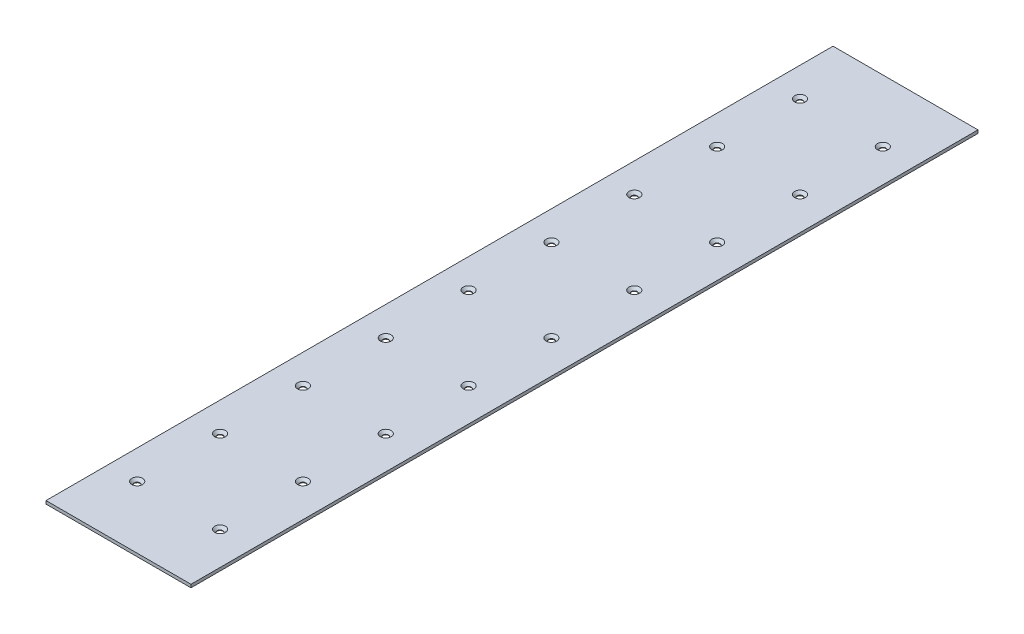
ISO-10303-21;
HEADER;
FILE_DESCRIPTION(('STEP AP214'),'2;1');
FILE_NAME('part.step','',(''),(''),'','','');
FILE_SCHEMA(('AUTOMOTIVE_DESIGN { 1 0 10303 214 1 1 1 1 }'));
ENDSEC;
DATA;
#1=APPLICATION_CONTEXT('core data for automotive mechanical design processes');
#2=APPLICATION_PROTOCOL_DEFINITION('international standard','automotive_design',2000,#1);
#3=PRODUCT_CONTEXT('',#1,'mechanical');
#4=PRODUCT('Part','Part','',(#3));
#5=PRODUCT_RELATED_PRODUCT_CATEGORY('part','',(#4));
#6=PRODUCT_DEFINITION_FORMATION('','',#4);
#7=PRODUCT_DEFINITION_CONTEXT('part definition',#1,'design');
#8=PRODUCT_DEFINITION('design','',#6,#7);
#9=PRODUCT_DEFINITION_SHAPE('','',#8);
#10=(LENGTH_UNIT() NAMED_UNIT(*) SI_UNIT(.MILLI.,.METRE.));
#11=(NAMED_UNIT(*) PLANE_ANGLE_UNIT() SI_UNIT($,.RADIAN.));
#12=(NAMED_UNIT(*) SI_UNIT($,.STERADIAN.) SOLID_ANGLE_UNIT());
#13=UNCERTAINTY_MEASURE_WITH_UNIT(LENGTH_MEASURE(1.E-05),#10,'distance_accuracy_value','');
#14=(GEOMETRIC_REPRESENTATION_CONTEXT(3) GLOBAL_UNCERTAINTY_ASSIGNED_CONTEXT((#13)) GLOBAL_UNIT_ASSIGNED_CONTEXT((#10,
#11,#12)) REPRESENTATION_CONTEXT('',''));
#15=CARTESIAN_POINT('',(0.,0.,0.));
#16=DIRECTION('',(0.,0.,1.));
#17=DIRECTION('',(1.,0.,0.));
#18=AXIS2_PLACEMENT_3D('',#15,#16,#17);
#19=CARTESIAN_POINT('',(0.,-3.,380.));
#20=DIRECTION('',(0.,1.,0.));
#21=DIRECTION('',(0.,0.,1.));
#22=AXIS2_PLACEMENT_3D('',#19,#20,#21);
#23=PLANE('',#22);
#24=CARTESIAN_POINT('',(108.094118077835,-3.,0.));
#25=DIRECTION('',(0.,1.,0.));
#26=DIRECTION('',(0.,0.,1.));
#27=AXIS2_PLACEMENT_3D('',#24,#25,#26);
#28=CIRCLE('',#27,2.75);
#29=CARTESIAN_POINT('',(108.094118077835,-3.,2.75));
#30=VERTEX_POINT('',#29);
#31=EDGE_CURVE('E268',#30,#30,#28,.T.);
#32=ORIENTED_EDGE('',*,*,#31,.T.);
#33=EDGE_LOOP('',(#32));
#34=FACE_BOUND('',#33,.T.);
#35=CARTESIAN_POINT('',(108.094118077835,-3.,-80.));
#36=DIRECTION('',(0.,1.,0.));
#37=DIRECTION('',(0.,0.,1.));
#38=AXIS2_PLACEMENT_3D('',#35,#36,#37);
#39=CIRCLE('',#38,2.75);
#40=CARTESIAN_POINT('',(108.094118077835,-3.,-77.25));
#41=VERTEX_POINT('',#40);
#42=EDGE_CURVE('E259',#41,#41,#39,.T.);
#43=ORIENTED_EDGE('',*,*,#42,.T.);
#44=EDGE_LOOP('',(#43));
#45=FACE_BOUND('',#44,.T.);
#46=CARTESIAN_POINT('',(108.094118077835,-3.,-160.));
#47=DIRECTION('',(0.,1.,0.));
#48=DIRECTION('',(0.,0.,1.));
#49=AXIS2_PLACEMENT_3D('',#46,#47,#48);
#50=CIRCLE('',#49,2.75);
#51=CARTESIAN_POINT('',(108.094118077835,-3.,-157.25));
#52=VERTEX_POINT('',#51);
#53=EDGE_CURVE('E250',#52,#52,#50,.T.);
#54=ORIENTED_EDGE('',*,*,#53,.T.);
#55=EDGE_LOOP('',(#54));
#56=FACE_BOUND('',#55,.T.);
#57=CARTESIAN_POINT('',(108.094118077835,-3.,-240.));
#58=DIRECTION('',(0.,1.,0.));
#59=DIRECTION('',(0.,0.,1.));
#60=AXIS2_PLACEMENT_3D('',#57,#58,#59);
#61=CIRCLE('',#60,2.75);
#62=CARTESIAN_POINT('',(108.094118077835,-3.,-237.25));
#63=VERTEX_POINT('',#62);
#64=EDGE_CURVE('E241',#63,#63,#61,.T.);
#65=ORIENTED_EDGE('',*,*,#64,.T.);
#66=EDGE_LOOP('',(#65));
#67=FACE_BOUND('',#66,.T.);
#68=CARTESIAN_POINT('',(108.094118077835,-3.,-320.));
#69=DIRECTION('',(0.,1.,0.));
#70=DIRECTION('',(0.,0.,1.));
#71=AXIS2_PLACEMENT_3D('',#68,#69,#70);
#72=CIRCLE('',#71,2.75);
#73=CARTESIAN_POINT('',(108.094118077835,-3.,-317.25));
#74=VERTEX_POINT('',#73);
#75=EDGE_CURVE('E232',#74,#74,#72,.T.);
#76=ORIENTED_EDGE('',*,*,#75,.T.);
#77=EDGE_LOOP('',(#76));
#78=FACE_BOUND('',#77,.T.);
#79=CARTESIAN_POINT('',(108.094118077835,-3.,80.));
#80=DIRECTION('',(0.,1.,0.));
#81=DIRECTION('',(0.,0.,1.));
#82=AXIS2_PLACEMENT_3D('',#79,#80,#81);
#83=CIRCLE('',#82,2.75);
#84=CARTESIAN_POINT('',(108.094118077835,-3.,82.75));
#85=VERTEX_POINT('',#84);
#86=EDGE_CURVE('E223',#85,#85,#83,.T.);
#87=ORIENTED_EDGE('',*,*,#86,.T.);
#88=EDGE_LOOP('',(#87));
#89=FACE_BOUND('',#88,.T.);
#90=CARTESIAN_POINT('',(108.094118077835,-3.,160.));
#91=DIRECTION('',(0.,1.,0.));
#92=DIRECTION('',(0.,0.,1.));
#93=AXIS2_PLACEMENT_3D('',#90,#91,#92);
#94=CIRCLE('',#93,2.75);
#95=CARTESIAN_POINT('',(108.094118077835,-3.,162.75));
#96=VERTEX_POINT('',#95);
#97=EDGE_CURVE('E214',#96,#96,#94,.T.);
#98=ORIENTED_EDGE('',*,*,#97,.T.);
#99=EDGE_LOOP('',(#98));
#100=FACE_BOUND('',#99,.T.);
#101=CARTESIAN_POINT('',(108.094118077835,-3.,240.));
#102=DIRECTION('',(0.,1.,0.));
#103=DIRECTION('',(0.,0.,1.));
#104=AXIS2_PLACEMENT_3D('',#101,#102,#103);
#105=CIRCLE('',#104,2.75);
#106=CARTESIAN_POINT('',(108.094118077835,-3.,242.75));
#107=VERTEX_POINT('',#106);
#108=EDGE_CURVE('E205',#107,#107,#105,.T.);
#109=ORIENTED_EDGE('',*,*,#108,.T.);
#110=EDGE_LOOP('',(#109));
#111=FACE_BOUND('',#110,.T.);
#112=CARTESIAN_POINT('',(108.094118077835,-3.,320.));
#113=DIRECTION('',(0.,1.,0.));
#114=DIRECTION('',(0.,0.,1.));
#115=AXIS2_PLACEMENT_3D('',#112,#113,#114);
#116=CIRCLE('',#115,2.75);
#117=CARTESIAN_POINT('',(108.094118077835,-3.,322.75));
#118=VERTEX_POINT('',#117);
#119=EDGE_CURVE('E196',#118,#118,#116,.T.);
#120=ORIENTED_EDGE('',*,*,#119,.T.);
#121=EDGE_LOOP('',(#120));
#122=FACE_BOUND('',#121,.T.);
#123=CARTESIAN_POINT('',(28.0941180778347,-3.,0.));
#124=DIRECTION('',(0.,1.,0.));
#125=DIRECTION('',(0.,0.,1.));
#126=AXIS2_PLACEMENT_3D('',#123,#124,#125);
#127=CIRCLE('',#126,2.75);
#128=CARTESIAN_POINT('',(28.0941180778347,-3.,2.75));
#129=VERTEX_POINT('',#128);
#130=EDGE_CURVE('E187',#129,#129,#127,.T.);
#131=ORIENTED_EDGE('',*,*,#130,.T.);
#132=EDGE_LOOP('',(#131));
#133=FACE_BOUND('',#132,.T.);
#134=CARTESIAN_POINT('',(28.0941180778347,-3.,-80.));
#135=DIRECTION('',(0.,1.,0.));
#136=DIRECTION('',(0.,0.,1.));
#137=AXIS2_PLACEMENT_3D('',#134,#135,#136);
#138=CIRCLE('',#137,2.75);
#139=CARTESIAN_POINT('',(28.0941180778347,-3.,-77.25));
#140=VERTEX_POINT('',#139);
#141=EDGE_CURVE('E178',#140,#140,#138,.T.);
#142=ORIENTED_EDGE('',*,*,#141,.T.);
#143=EDGE_LOOP('',(#142));
#144=FACE_BOUND('',#143,.T.);
#145=CARTESIAN_POINT('',(28.0941180778347,-3.,-160.));
#146=DIRECTION('',(0.,1.,0.));
#147=DIRECTION('',(0.,0.,1.));
#148=AXIS2_PLACEMENT_3D('',#145,#146,#147);
#149=CIRCLE('',#148,2.75);
#150=CARTESIAN_POINT('',(28.0941180778347,-3.,-157.25));
#151=VERTEX_POINT('',#150);
#152=EDGE_CURVE('E169',#151,#151,#149,.T.);
#153=ORIENTED_EDGE('',*,*,#152,.T.);
#154=EDGE_LOOP('',(#153));
#155=FACE_BOUND('',#154,.T.);
#156=CARTESIAN_POINT('',(28.0941180778347,-3.,-240.));
#157=DIRECTION('',(0.,1.,0.));
#158=DIRECTION('',(0.,0.,1.));
#159=AXIS2_PLACEMENT_3D('',#156,#157,#158);
#160=CIRCLE('',#159,2.75);
#161=CARTESIAN_POINT('',(28.0941180778347,-3.,-237.25));
#162=VERTEX_POINT('',#161);
#163=EDGE_CURVE('E160',#162,#162,#160,.T.);
#164=ORIENTED_EDGE('',*,*,#163,.T.);
#165=EDGE_LOOP('',(#164));
#166=FACE_BOUND('',#165,.T.);
#167=CARTESIAN_POINT('',(28.0941180778347,-3.,-320.));
#168=DIRECTION('',(0.,1.,0.));
#169=DIRECTION('',(0.,0.,1.));
#170=AXIS2_PLACEMENT_3D('',#167,#168,#169);
#171=CIRCLE('',#170,2.75);
#172=CARTESIAN_POINT('',(28.0941180778347,-3.,-317.25));
#173=VERTEX_POINT('',#172);
#174=EDGE_CURVE('E151',#173,#173,#171,.T.);
#175=ORIENTED_EDGE('',*,*,#174,.T.);
#176=EDGE_LOOP('',(#175));
#177=FACE_BOUND('',#176,.T.);
#178=CARTESIAN_POINT('',(28.0941180778347,-3.,80.));
#179=DIRECTION('',(0.,1.,0.));
#180=DIRECTION('',(0.,0.,1.));
#181=AXIS2_PLACEMENT_3D('',#178,#179,#180);
#182=CIRCLE('',#181,2.75);
#183=CARTESIAN_POINT('',(28.0941180778347,-3.,82.75));
#184=VERTEX_POINT('',#183);
#185=EDGE_CURVE('E142',#184,#184,#182,.T.);
#186=ORIENTED_EDGE('',*,*,#185,.T.);
#187=EDGE_LOOP('',(#186));
#188=FACE_BOUND('',#187,.T.);
#189=CARTESIAN_POINT('',(28.0941180778347,-3.,160.));
#190=DIRECTION('',(0.,1.,0.));
#191=DIRECTION('',(0.,0.,1.));
#192=AXIS2_PLACEMENT_3D('',#189,#190,#191);
#193=CIRCLE('',#192,2.75);
#194=CARTESIAN_POINT('',(28.0941180778347,-3.,162.75));
#195=VERTEX_POINT('',#194);
#196=EDGE_CURVE('E133',#195,#195,#193,.T.);
#197=ORIENTED_EDGE('',*,*,#196,.T.);
#198=EDGE_LOOP('',(#197));
#199=FACE_BOUND('',#198,.T.);
#200=CARTESIAN_POINT('',(28.0941180778347,-3.,240.));
#201=DIRECTION('',(0.,1.,0.));
#202=DIRECTION('',(0.,0.,1.));
#203=AXIS2_PLACEMENT_3D('',#200,#201,#202);
#204=CIRCLE('',#203,2.75);
#205=CARTESIAN_POINT('',(28.0941180778347,-3.,242.75));
#206=VERTEX_POINT('',#205);
#207=EDGE_CURVE('E124',#206,#206,#204,.T.);
#208=ORIENTED_EDGE('',*,*,#207,.T.);
#209=EDGE_LOOP('',(#208));
#210=FACE_BOUND('',#209,.T.);
#211=CARTESIAN_POINT('',(28.0941180778347,-3.,320.));
#212=DIRECTION('',(0.,1.,0.));
#213=DIRECTION('',(0.,0.,1.));
#214=AXIS2_PLACEMENT_3D('',#211,#212,#213);
#215=CIRCLE('',#214,2.75);
#216=CARTESIAN_POINT('',(28.0941180778347,-3.,322.75));
#217=VERTEX_POINT('',#216);
#218=EDGE_CURVE('E106',#217,#217,#215,.T.);
#219=ORIENTED_EDGE('',*,*,#218,.T.);
#220=EDGE_LOOP('',(#219));
#221=FACE_BOUND('',#220,.T.);
#222=DIRECTION('',(1.,0.,0.));
#223=VECTOR('',#222,1.);
#224=CARTESIAN_POINT('',(0.,-3.,-380.));
#225=LINE('',#224,#223);
#226=CARTESIAN_POINT('',(0.,-3.,-380.));
#227=VERTEX_POINT('',#226);
#228=CARTESIAN_POINT('',(140.,-3.,-380.));
#229=VERTEX_POINT('',#228);
#230=EDGE_CURVE('E104',#227,#229,#225,.T.);
#231=ORIENTED_EDGE('',*,*,#230,.T.);
#232=DIRECTION('',(0.,0.,-1.));
#233=VECTOR('',#232,1.);
#234=CARTESIAN_POINT('',(140.,-3.,380.));
#235=LINE('',#234,#233);
#236=CARTESIAN_POINT('',(140.,-3.,380.));
#237=VERTEX_POINT('',#236);
#238=EDGE_CURVE('E12',#237,#229,#235,.T.);
#239=ORIENTED_EDGE('',*,*,#238,.F.);
#240=DIRECTION('',(1.,0.,0.));
#241=VECTOR('',#240,1.);
#242=CARTESIAN_POINT('',(0.,-3.,380.));
#243=LINE('',#242,#241);
#244=CARTESIAN_POINT('',(0.,-3.,380.));
#245=VERTEX_POINT('',#244);
#246=EDGE_CURVE('E81',#245,#237,#243,.T.);
#247=ORIENTED_EDGE('',*,*,#246,.F.);
#248=DIRECTION('',(0.,0.,-1.));
#249=VECTOR('',#248,1.);
#250=CARTESIAN_POINT('',(0.,-3.,380.));
#251=LINE('',#250,#249);
#252=EDGE_CURVE('E57',#245,#227,#251,.T.);
#253=ORIENTED_EDGE('',*,*,#252,.T.);
#254=EDGE_LOOP('',(#231,#239,#247,#253));
#255=FACE_BOUND('',#254,.T.);
#256=ADVANCED_FACE('F41',(#34,#45,#56,#67,#78,#89,#100,#111,#122,#133,#144,#155,#166,#177,#188,
#199,#210,#221,#255),#23,.F.);
#257=CARTESIAN_POINT('',(140.,0.,380.));
#258=DIRECTION('',(1.,0.,0.));
#259=DIRECTION('',(0.,0.,-1.));
#260=AXIS2_PLACEMENT_3D('',#257,#258,#259);
#261=PLANE('',#260);
#262=DIRECTION('',(0.,-1.,0.));
#263=VECTOR('',#262,1.);
#264=CARTESIAN_POINT('',(140.,0.,-380.));
#265=LINE('',#264,#263);
#266=CARTESIAN_POINT('',(140.,0.,-380.));
#267=VERTEX_POINT('',#266);
#268=EDGE_CURVE('E90',#267,#229,#265,.T.);
#269=ORIENTED_EDGE('',*,*,#268,.F.);
#270=DIRECTION('',(0.,0.,-1.));
#271=VECTOR('',#270,1.);
#272=CARTESIAN_POINT('',(140.,0.,380.));
#273=LINE('',#272,#271);
#274=CARTESIAN_POINT('',(140.,0.,380.));
#275=VERTEX_POINT('',#274);
#276=EDGE_CURVE('E49',#275,#267,#273,.T.);
#277=ORIENTED_EDGE('',*,*,#276,.F.);
#278=DIRECTION('',(0.,-1.,0.));
#279=VECTOR('',#278,1.);
#280=CARTESIAN_POINT('',(140.,0.,380.));
#281=LINE('',#280,#279);
#282=EDGE_CURVE('E88',#275,#237,#281,.T.);
#283=ORIENTED_EDGE('',*,*,#282,.T.);
#284=ORIENTED_EDGE('',*,*,#238,.T.);
#285=EDGE_LOOP('',(#269,#277,#283,#284));
#286=FACE_BOUND('',#285,.T.);
#287=ADVANCED_FACE('F87',(#286),#261,.T.);
#288=CARTESIAN_POINT('',(0.,0.,380.));
#289=DIRECTION('',(0.,1.,0.));
#290=DIRECTION('',(0.,0.,1.));
#291=AXIS2_PLACEMENT_3D('',#288,#289,#290);
#292=PLANE('',#291);
#293=CARTESIAN_POINT('',(108.094118077835,0.,0.));
#294=DIRECTION('',(0.,1.,0.));
#295=DIRECTION('',(0.,0.,1.));
#296=AXIS2_PLACEMENT_3D('',#293,#294,#295);
#297=CIRCLE('',#296,5.2);
#298=CARTESIAN_POINT('',(108.094118077835,0.,5.2));
#299=VERTEX_POINT('',#298);
#300=EDGE_CURVE('E274',#299,#299,#297,.T.);
#301=ORIENTED_EDGE('',*,*,#300,.F.);
#302=EDGE_LOOP('',(#301));
#303=FACE_BOUND('',#302,.T.);
#304=CARTESIAN_POINT('',(108.094118077835,0.,-80.));
#305=DIRECTION('',(0.,1.,0.));
#306=DIRECTION('',(0.,0.,1.));
#307=AXIS2_PLACEMENT_3D('',#304,#305,#306);
#308=CIRCLE('',#307,5.2);
#309=CARTESIAN_POINT('',(108.094118077835,0.,-74.8));
#310=VERTEX_POINT('',#309);
#311=EDGE_CURVE('E265',#310,#310,#308,.T.);
#312=ORIENTED_EDGE('',*,*,#311,.F.);
#313=EDGE_LOOP('',(#312));
#314=FACE_BOUND('',#313,.T.);
#315=CARTESIAN_POINT('',(108.094118077835,0.,-160.));
#316=DIRECTION('',(0.,1.,0.));
#317=DIRECTION('',(0.,0.,1.));
#318=AXIS2_PLACEMENT_3D('',#315,#316,#317);
#319=CIRCLE('',#318,5.2);
#320=CARTESIAN_POINT('',(108.094118077835,0.,-154.8));
#321=VERTEX_POINT('',#320);
#322=EDGE_CURVE('E256',#321,#321,#319,.T.);
#323=ORIENTED_EDGE('',*,*,#322,.F.);
#324=EDGE_LOOP('',(#323));
#325=FACE_BOUND('',#324,.T.);
#326=CARTESIAN_POINT('',(108.094118077835,0.,-240.));
#327=DIRECTION('',(0.,1.,0.));
#328=DIRECTION('',(0.,0.,1.));
#329=AXIS2_PLACEMENT_3D('',#326,#327,#328);
#330=CIRCLE('',#329,5.2);
#331=CARTESIAN_POINT('',(108.094118077835,0.,-234.8));
#332=VERTEX_POINT('',#331);
#333=EDGE_CURVE('E247',#332,#332,#330,.T.);
#334=ORIENTED_EDGE('',*,*,#333,.F.);
#335=EDGE_LOOP('',(#334));
#336=FACE_BOUND('',#335,.T.);
#337=CARTESIAN_POINT('',(108.094118077835,0.,-320.));
#338=DIRECTION('',(0.,1.,0.));
#339=DIRECTION('',(0.,0.,1.));
#340=AXIS2_PLACEMENT_3D('',#337,#338,#339);
#341=CIRCLE('',#340,5.2);
#342=CARTESIAN_POINT('',(108.094118077835,0.,-314.8));
#343=VERTEX_POINT('',#342);
#344=EDGE_CURVE('E238',#343,#343,#341,.T.);
#345=ORIENTED_EDGE('',*,*,#344,.F.);
#346=EDGE_LOOP('',(#345));
#347=FACE_BOUND('',#346,.T.);
#348=CARTESIAN_POINT('',(108.094118077835,0.,80.));
#349=DIRECTION('',(0.,1.,0.));
#350=DIRECTION('',(0.,0.,1.));
#351=AXIS2_PLACEMENT_3D('',#348,#349,#350);
#352=CIRCLE('',#351,5.2);
#353=CARTESIAN_POINT('',(108.094118077835,0.,85.2));
#354=VERTEX_POINT('',#353);
#355=EDGE_CURVE('E229',#354,#354,#352,.T.);
#356=ORIENTED_EDGE('',*,*,#355,.F.);
#357=EDGE_LOOP('',(#356));
#358=FACE_BOUND('',#357,.T.);
#359=CARTESIAN_POINT('',(108.094118077835,0.,160.));
#360=DIRECTION('',(0.,1.,0.));
#361=DIRECTION('',(0.,0.,1.));
#362=AXIS2_PLACEMENT_3D('',#359,#360,#361);
#363=CIRCLE('',#362,5.2);
#364=CARTESIAN_POINT('',(108.094118077835,0.,165.2));
#365=VERTEX_POINT('',#364);
#366=EDGE_CURVE('E220',#365,#365,#363,.T.);
#367=ORIENTED_EDGE('',*,*,#366,.F.);
#368=EDGE_LOOP('',(#367));
#369=FACE_BOUND('',#368,.T.);
#370=CARTESIAN_POINT('',(108.094118077835,0.,240.));
#371=DIRECTION('',(0.,1.,0.));
#372=DIRECTION('',(0.,0.,1.));
#373=AXIS2_PLACEMENT_3D('',#370,#371,#372);
#374=CIRCLE('',#373,5.2);
#375=CARTESIAN_POINT('',(108.094118077835,0.,245.2));
#376=VERTEX_POINT('',#375);
#377=EDGE_CURVE('E211',#376,#376,#374,.T.);
#378=ORIENTED_EDGE('',*,*,#377,.F.);
#379=EDGE_LOOP('',(#378));
#380=FACE_BOUND('',#379,.T.);
#381=CARTESIAN_POINT('',(108.094118077835,0.,320.));
#382=DIRECTION('',(0.,1.,0.));
#383=DIRECTION('',(0.,0.,1.));
#384=AXIS2_PLACEMENT_3D('',#381,#382,#383);
#385=CIRCLE('',#384,5.2);
#386=CARTESIAN_POINT('',(108.094118077835,0.,325.2));
#387=VERTEX_POINT('',#386);
#388=EDGE_CURVE('E202',#387,#387,#385,.T.);
#389=ORIENTED_EDGE('',*,*,#388,.F.);
#390=EDGE_LOOP('',(#389));
#391=FACE_BOUND('',#390,.T.);
#392=CARTESIAN_POINT('',(28.0941180778347,0.,0.));
#393=DIRECTION('',(0.,1.,0.));
#394=DIRECTION('',(0.,0.,1.));
#395=AXIS2_PLACEMENT_3D('',#392,#393,#394);
#396=CIRCLE('',#395,5.2);
#397=CARTESIAN_POINT('',(28.0941180778347,0.,5.2));
#398=VERTEX_POINT('',#397);
#399=EDGE_CURVE('E193',#398,#398,#396,.T.);
#400=ORIENTED_EDGE('',*,*,#399,.F.);
#401=EDGE_LOOP('',(#400));
#402=FACE_BOUND('',#401,.T.);
#403=CARTESIAN_POINT('',(28.0941180778347,0.,-80.));
#404=DIRECTION('',(0.,1.,0.));
#405=DIRECTION('',(0.,0.,1.));
#406=AXIS2_PLACEMENT_3D('',#403,#404,#405);
#407=CIRCLE('',#406,5.2);
#408=CARTESIAN_POINT('',(28.0941180778347,0.,-74.8));
#409=VERTEX_POINT('',#408);
#410=EDGE_CURVE('E184',#409,#409,#407,.T.);
#411=ORIENTED_EDGE('',*,*,#410,.F.);
#412=EDGE_LOOP('',(#411));
#413=FACE_BOUND('',#412,.T.);
#414=CARTESIAN_POINT('',(28.0941180778347,0.,-160.));
#415=DIRECTION('',(0.,1.,0.));
#416=DIRECTION('',(0.,0.,1.));
#417=AXIS2_PLACEMENT_3D('',#414,#415,#416);
#418=CIRCLE('',#417,5.2);
#419=CARTESIAN_POINT('',(28.0941180778347,0.,-154.8));
#420=VERTEX_POINT('',#419);
#421=EDGE_CURVE('E175',#420,#420,#418,.T.);
#422=ORIENTED_EDGE('',*,*,#421,.F.);
#423=EDGE_LOOP('',(#422));
#424=FACE_BOUND('',#423,.T.);
#425=CARTESIAN_POINT('',(28.0941180778347,0.,-240.));
#426=DIRECTION('',(0.,1.,0.));
#427=DIRECTION('',(0.,0.,1.));
#428=AXIS2_PLACEMENT_3D('',#425,#426,#427);
#429=CIRCLE('',#428,5.2);
#430=CARTESIAN_POINT('',(28.0941180778347,0.,-234.8));
#431=VERTEX_POINT('',#430);
#432=EDGE_CURVE('E166',#431,#431,#429,.T.);
#433=ORIENTED_EDGE('',*,*,#432,.F.);
#434=EDGE_LOOP('',(#433));
#435=FACE_BOUND('',#434,.T.);
#436=CARTESIAN_POINT('',(28.0941180778347,0.,-320.));
#437=DIRECTION('',(0.,1.,0.));
#438=DIRECTION('',(0.,0.,1.));
#439=AXIS2_PLACEMENT_3D('',#436,#437,#438);
#440=CIRCLE('',#439,5.2);
#441=CARTESIAN_POINT('',(28.0941180778347,0.,-314.8));
#442=VERTEX_POINT('',#441);
#443=EDGE_CURVE('E157',#442,#442,#440,.T.);
#444=ORIENTED_EDGE('',*,*,#443,.F.);
#445=EDGE_LOOP('',(#444));
#446=FACE_BOUND('',#445,.T.);
#447=CARTESIAN_POINT('',(28.0941180778347,0.,80.));
#448=DIRECTION('',(0.,1.,0.));
#449=DIRECTION('',(0.,0.,1.));
#450=AXIS2_PLACEMENT_3D('',#447,#448,#449);
#451=CIRCLE('',#450,5.2);
#452=CARTESIAN_POINT('',(28.0941180778347,0.,85.2));
#453=VERTEX_POINT('',#452);
#454=EDGE_CURVE('E148',#453,#453,#451,.T.);
#455=ORIENTED_EDGE('',*,*,#454,.F.);
#456=EDGE_LOOP('',(#455));
#457=FACE_BOUND('',#456,.T.);
#458=CARTESIAN_POINT('',(28.0941180778347,0.,160.));
#459=DIRECTION('',(0.,1.,0.));
#460=DIRECTION('',(0.,0.,1.));
#461=AXIS2_PLACEMENT_3D('',#458,#459,#460);
#462=CIRCLE('',#461,5.2);
#463=CARTESIAN_POINT('',(28.0941180778347,0.,165.2));
#464=VERTEX_POINT('',#463);
#465=EDGE_CURVE('E139',#464,#464,#462,.T.);
#466=ORIENTED_EDGE('',*,*,#465,.F.);
#467=EDGE_LOOP('',(#466));
#468=FACE_BOUND('',#467,.T.);
#469=CARTESIAN_POINT('',(28.0941180778347,0.,240.));
#470=DIRECTION('',(0.,1.,0.));
#471=DIRECTION('',(0.,0.,1.));
#472=AXIS2_PLACEMENT_3D('',#469,#470,#471);
#473=CIRCLE('',#472,5.2);
#474=CARTESIAN_POINT('',(28.0941180778347,0.,245.2));
#475=VERTEX_POINT('',#474);
#476=EDGE_CURVE('E130',#475,#475,#473,.T.);
#477=ORIENTED_EDGE('',*,*,#476,.F.);
#478=EDGE_LOOP('',(#477));
#479=FACE_BOUND('',#478,.T.);
#480=CARTESIAN_POINT('',(28.0941180778347,0.,320.));
#481=DIRECTION('',(0.,1.,0.));
#482=DIRECTION('',(0.,0.,1.));
#483=AXIS2_PLACEMENT_3D('',#480,#481,#482);
#484=CIRCLE('',#483,5.2);
#485=CARTESIAN_POINT('',(28.0941180778347,0.,325.2));
#486=VERTEX_POINT('',#485);
#487=EDGE_CURVE('E121',#486,#486,#484,.T.);
#488=ORIENTED_EDGE('',*,*,#487,.F.);
#489=EDGE_LOOP('',(#488));
#490=FACE_BOUND('',#489,.T.);
#491=DIRECTION('',(1.,0.,0.));
#492=VECTOR('',#491,1.);
#493=CARTESIAN_POINT('',(0.,0.,-380.));
#494=LINE('',#493,#492);
#495=CARTESIAN_POINT('',(0.,0.,-380.));
#496=VERTEX_POINT('',#495);
#497=EDGE_CURVE('E108',#496,#267,#494,.T.);
#498=ORIENTED_EDGE('',*,*,#497,.F.);
#499=DIRECTION('',(0.,0.,-1.));
#500=VECTOR('',#499,1.);
#501=CARTESIAN_POINT('',(0.,0.,380.));
#502=LINE('',#501,#500);
#503=CARTESIAN_POINT('',(0.,0.,380.));
#504=VERTEX_POINT('',#503);
#505=EDGE_CURVE('E70',#504,#496,#502,.T.);
#506=ORIENTED_EDGE('',*,*,#505,.F.);
#507=DIRECTION('',(1.,0.,0.));
#508=VECTOR('',#507,1.);
#509=CARTESIAN_POINT('',(0.,0.,380.));
#510=LINE('',#509,#508);
#511=EDGE_CURVE('E96',#504,#275,#510,.T.);
#512=ORIENTED_EDGE('',*,*,#511,.T.);
#513=ORIENTED_EDGE('',*,*,#276,.T.);
#514=EDGE_LOOP('',(#498,#506,#512,#513));
#515=FACE_BOUND('',#514,.T.);
#516=ADVANCED_FACE('F98',(#303,#314,#325,#336,#347,#358,#369,#380,#391,#402,#413,#424,#435,#446,
#457,#468,#479,#490,#515),#292,.T.);
#517=CARTESIAN_POINT('',(0.,-3.,380.));
#518=DIRECTION('',(-1.,0.,0.));
#519=DIRECTION('',(0.,0.,1.));
#520=AXIS2_PLACEMENT_3D('',#517,#518,#519);
#521=PLANE('',#520);
#522=DIRECTION('',(0.,1.,0.));
#523=VECTOR('',#522,1.);
#524=CARTESIAN_POINT('',(0.,-3.,-380.));
#525=LINE('',#524,#523);
#526=EDGE_CURVE('E110',#227,#496,#525,.T.);
#527=ORIENTED_EDGE('',*,*,#526,.F.);
#528=ORIENTED_EDGE('',*,*,#252,.F.);
#529=DIRECTION('',(0.,1.,0.));
#530=VECTOR('',#529,1.);
#531=CARTESIAN_POINT('',(0.,-3.,380.));
#532=LINE('',#531,#530);
#533=EDGE_CURVE('E99',#245,#504,#532,.T.);
#534=ORIENTED_EDGE('',*,*,#533,.T.);
#535=ORIENTED_EDGE('',*,*,#505,.T.);
#536=EDGE_LOOP('',(#527,#528,#534,#535));
#537=FACE_BOUND('',#536,.T.);
#538=ADVANCED_FACE('F282',(#537),#521,.T.);
#539=CARTESIAN_POINT('',(0.,0.,380.));
#540=DIRECTION('',(0.,0.,-1.));
#541=DIRECTION('',(-1.,0.,0.));
#542=AXIS2_PLACEMENT_3D('',#539,#540,#541);
#543=PLANE('',#542);
#544=ORIENTED_EDGE('',*,*,#246,.T.);
#545=ORIENTED_EDGE('',*,*,#282,.F.);
#546=ORIENTED_EDGE('',*,*,#511,.F.);
#547=ORIENTED_EDGE('',*,*,#533,.F.);
#548=EDGE_LOOP('',(#544,#545,#546,#547));
#549=FACE_BOUND('',#548,.T.);
#550=ADVANCED_FACE('F95',(#549),#543,.F.);
#551=CARTESIAN_POINT('',(0.,0.,-380.));
#552=DIRECTION('',(0.,0.,-1.));
#553=DIRECTION('',(-1.,0.,0.));
#554=AXIS2_PLACEMENT_3D('',#551,#552,#553);
#555=PLANE('',#554);
#556=ORIENTED_EDGE('',*,*,#230,.F.);
#557=ORIENTED_EDGE('',*,*,#526,.T.);
#558=ORIENTED_EDGE('',*,*,#497,.T.);
#559=ORIENTED_EDGE('',*,*,#268,.T.);
#560=EDGE_LOOP('',(#556,#557,#558,#559));
#561=FACE_BOUND('',#560,.T.);
#562=ADVANCED_FACE('F331',(#561),#555,.T.);
#563=CARTESIAN_POINT('',(28.0941180778347,0.,320.));
#564=DIRECTION('',(0.,1.,0.));
#565=DIRECTION('',(0.,0.,1.));
#566=AXIS2_PLACEMENT_3D('',#563,#564,#565);
#567=CYLINDRICAL_SURFACE('',#566,2.75);
#568=ORIENTED_EDGE('',*,*,#218,.F.);
#569=EDGE_LOOP('',(#568));
#570=FACE_BOUND('',#569,.T.);
#571=CARTESIAN_POINT('',(28.0941180778347,-2.45,320.));
#572=DIRECTION('',(0.,1.,0.));
#573=DIRECTION('',(0.,0.,1.));
#574=AXIS2_PLACEMENT_3D('',#571,#572,#573);
#575=CIRCLE('',#574,2.75);
#576=CARTESIAN_POINT('',(28.0941180778347,-2.45,322.75));
#577=VERTEX_POINT('',#576);
#578=EDGE_CURVE('E118',#577,#577,#575,.T.);
#579=ORIENTED_EDGE('',*,*,#578,.T.);
#580=EDGE_LOOP('',(#579));
#581=FACE_BOUND('',#580,.T.);
#582=ADVANCED_FACE('F321',(#570,#581),#567,.F.);
#583=CARTESIAN_POINT('',(28.0941180778347,0.,320.));
#584=DIRECTION('',(0.,1.,0.));
#585=DIRECTION('',(0.,0.,1.));
#586=AXIS2_PLACEMENT_3D('',#583,#584,#585);
#587=CONICAL_SURFACE('',#586,5.2,0.785398163397447);
#588=ORIENTED_EDGE('',*,*,#578,.F.);
#589=EDGE_LOOP('',(#588));
#590=FACE_BOUND('',#589,.T.);
#591=ORIENTED_EDGE('',*,*,#487,.T.);
#592=EDGE_LOOP('',(#591));
#593=FACE_BOUND('',#592,.T.);
#594=ADVANCED_FACE('F318',(#590,#593),#587,.F.);
#595=CARTESIAN_POINT('',(28.0941180778347,0.,240.));
#596=DIRECTION('',(0.,1.,0.));
#597=DIRECTION('',(0.,0.,1.));
#598=AXIS2_PLACEMENT_3D('',#595,#596,#597);
#599=CYLINDRICAL_SURFACE('',#598,2.75);
#600=ORIENTED_EDGE('',*,*,#207,.F.);
#601=EDGE_LOOP('',(#600));
#602=FACE_BOUND('',#601,.T.);
#603=CARTESIAN_POINT('',(28.0941180778347,-2.45,240.));
#604=DIRECTION('',(0.,1.,0.));
#605=DIRECTION('',(0.,0.,1.));
#606=AXIS2_PLACEMENT_3D('',#603,#604,#605);
#607=CIRCLE('',#606,2.75);
#608=CARTESIAN_POINT('',(28.0941180778347,-2.45,242.75));
#609=VERTEX_POINT('',#608);
#610=EDGE_CURVE('E127',#609,#609,#607,.T.);
#611=ORIENTED_EDGE('',*,*,#610,.T.);
#612=EDGE_LOOP('',(#611));
#613=FACE_BOUND('',#612,.T.);
#614=ADVANCED_FACE('F320',(#602,#613),#599,.F.);
#615=CARTESIAN_POINT('',(28.0941180778347,0.,240.));
#616=DIRECTION('',(0.,1.,0.));
#617=DIRECTION('',(0.,0.,1.));
#618=AXIS2_PLACEMENT_3D('',#615,#616,#617);
#619=CONICAL_SURFACE('',#618,5.2,0.785398163397447);
#620=ORIENTED_EDGE('',*,*,#610,.F.);
#621=EDGE_LOOP('',(#620));
#622=FACE_BOUND('',#621,.T.);
#623=ORIENTED_EDGE('',*,*,#476,.T.);
#624=EDGE_LOOP('',(#623));
#625=FACE_BOUND('',#624,.T.);
#626=ADVANCED_FACE('F328',(#622,#625),#619,.F.);
#627=CARTESIAN_POINT('',(28.0941180778347,0.,160.));
#628=DIRECTION('',(0.,1.,0.));
#629=DIRECTION('',(0.,0.,1.));
#630=AXIS2_PLACEMENT_3D('',#627,#628,#629);
#631=CYLINDRICAL_SURFACE('',#630,2.75);
#632=ORIENTED_EDGE('',*,*,#196,.F.);
#633=EDGE_LOOP('',(#632));
#634=FACE_BOUND('',#633,.T.);
#635=CARTESIAN_POINT('',(28.0941180778347,-2.45,160.));
#636=DIRECTION('',(0.,1.,0.));
#637=DIRECTION('',(0.,0.,1.));
#638=AXIS2_PLACEMENT_3D('',#635,#636,#637);
#639=CIRCLE('',#638,2.75);
#640=CARTESIAN_POINT('',(28.0941180778347,-2.45,162.75));
#641=VERTEX_POINT('',#640);
#642=EDGE_CURVE('E136',#641,#641,#639,.T.);
#643=ORIENTED_EDGE('',*,*,#642,.T.);
#644=EDGE_LOOP('',(#643));
#645=FACE_BOUND('',#644,.T.);
#646=ADVANCED_FACE('F425',(#634,#645),#631,.F.);
#647=CARTESIAN_POINT('',(28.0941180778347,0.,160.));
#648=DIRECTION('',(0.,1.,0.));
#649=DIRECTION('',(0.,0.,1.));
#650=AXIS2_PLACEMENT_3D('',#647,#648,#649);
#651=CONICAL_SURFACE('',#650,5.2,0.785398163397447);
#652=ORIENTED_EDGE('',*,*,#642,.F.);
#653=EDGE_LOOP('',(#652));
#654=FACE_BOUND('',#653,.T.);
#655=ORIENTED_EDGE('',*,*,#465,.T.);
#656=EDGE_LOOP('',(#655));
#657=FACE_BOUND('',#656,.T.);
#658=ADVANCED_FACE('F435',(#654,#657),#651,.F.);
#659=CARTESIAN_POINT('',(28.0941180778347,0.,80.));
#660=DIRECTION('',(0.,1.,0.));
#661=DIRECTION('',(0.,0.,1.));
#662=AXIS2_PLACEMENT_3D('',#659,#660,#661);
#663=CYLINDRICAL_SURFACE('',#662,2.75);
#664=ORIENTED_EDGE('',*,*,#185,.F.);
#665=EDGE_LOOP('',(#664));
#666=FACE_BOUND('',#665,.T.);
#667=CARTESIAN_POINT('',(28.0941180778347,-2.45,80.));
#668=DIRECTION('',(0.,1.,0.));
#669=DIRECTION('',(0.,0.,1.));
#670=AXIS2_PLACEMENT_3D('',#667,#668,#669);
#671=CIRCLE('',#670,2.75);
#672=CARTESIAN_POINT('',(28.0941180778347,-2.45,82.75));
#673=VERTEX_POINT('',#672);
#674=EDGE_CURVE('E145',#673,#673,#671,.T.);
#675=ORIENTED_EDGE('',*,*,#674,.T.);
#676=EDGE_LOOP('',(#675));
#677=FACE_BOUND('',#676,.T.);
#678=ADVANCED_FACE('F445',(#666,#677),#663,.F.);
#679=CARTESIAN_POINT('',(28.0941180778347,0.,80.));
#680=DIRECTION('',(0.,1.,0.));
#681=DIRECTION('',(0.,0.,1.));
#682=AXIS2_PLACEMENT_3D('',#679,#680,#681);
#683=CONICAL_SURFACE('',#682,5.2,0.785398163397447);
#684=ORIENTED_EDGE('',*,*,#674,.F.);
#685=EDGE_LOOP('',(#684));
#686=FACE_BOUND('',#685,.T.);
#687=ORIENTED_EDGE('',*,*,#454,.T.);
#688=EDGE_LOOP('',(#687));
#689=FACE_BOUND('',#688,.T.);
#690=ADVANCED_FACE('F455',(#686,#689),#683,.F.);
#691=CARTESIAN_POINT('',(28.0941180778347,0.,-320.));
#692=DIRECTION('',(0.,1.,0.));
#693=DIRECTION('',(0.,0.,1.));
#694=AXIS2_PLACEMENT_3D('',#691,#692,#693);
#695=CYLINDRICAL_SURFACE('',#694,2.75);
#696=ORIENTED_EDGE('',*,*,#174,.F.);
#697=EDGE_LOOP('',(#696));
#698=FACE_BOUND('',#697,.T.);
#699=CARTESIAN_POINT('',(28.0941180778347,-2.45,-320.));
#700=DIRECTION('',(0.,1.,0.));
#701=DIRECTION('',(0.,0.,1.));
#702=AXIS2_PLACEMENT_3D('',#699,#700,#701);
#703=CIRCLE('',#702,2.75);
#704=CARTESIAN_POINT('',(28.0941180778347,-2.45,-317.25));
#705=VERTEX_POINT('',#704);
#706=EDGE_CURVE('E154',#705,#705,#703,.T.);
#707=ORIENTED_EDGE('',*,*,#706,.T.);
#708=EDGE_LOOP('',(#707));
#709=FACE_BOUND('',#708,.T.);
#710=ADVANCED_FACE('F465',(#698,#709),#695,.F.);
#711=CARTESIAN_POINT('',(28.0941180778347,0.,-320.));
#712=DIRECTION('',(0.,1.,0.));
#713=DIRECTION('',(0.,0.,1.));
#714=AXIS2_PLACEMENT_3D('',#711,#712,#713);
#715=CONICAL_SURFACE('',#714,5.2,0.785398163397447);
#716=ORIENTED_EDGE('',*,*,#706,.F.);
#717=EDGE_LOOP('',(#716));
#718=FACE_BOUND('',#717,.T.);
#719=ORIENTED_EDGE('',*,*,#443,.T.);
#720=EDGE_LOOP('',(#719));
#721=FACE_BOUND('',#720,.T.);
#722=ADVANCED_FACE('F475',(#718,#721),#715,.F.);
#723=CARTESIAN_POINT('',(28.0941180778347,0.,-240.));
#724=DIRECTION('',(0.,1.,0.));
#725=DIRECTION('',(0.,0.,1.));
#726=AXIS2_PLACEMENT_3D('',#723,#724,#725);
#727=CYLINDRICAL_SURFACE('',#726,2.75);
#728=ORIENTED_EDGE('',*,*,#163,.F.);
#729=EDGE_LOOP('',(#728));
#730=FACE_BOUND('',#729,.T.);
#731=CARTESIAN_POINT('',(28.0941180778347,-2.45,-240.));
#732=DIRECTION('',(0.,1.,0.));
#733=DIRECTION('',(0.,0.,1.));
#734=AXIS2_PLACEMENT_3D('',#731,#732,#733);
#735=CIRCLE('',#734,2.75);
#736=CARTESIAN_POINT('',(28.0941180778347,-2.45,-237.25));
#737=VERTEX_POINT('',#736);
#738=EDGE_CURVE('E163',#737,#737,#735,.T.);
#739=ORIENTED_EDGE('',*,*,#738,.T.);
#740=EDGE_LOOP('',(#739));
#741=FACE_BOUND('',#740,.T.);
#742=ADVANCED_FACE('F485',(#730,#741),#727,.F.);
#743=CARTESIAN_POINT('',(28.0941180778347,0.,-240.));
#744=DIRECTION('',(0.,1.,0.));
#745=DIRECTION('',(0.,0.,1.));
#746=AXIS2_PLACEMENT_3D('',#743,#744,#745);
#747=CONICAL_SURFACE('',#746,5.2,0.785398163397447);
#748=ORIENTED_EDGE('',*,*,#738,.F.);
#749=EDGE_LOOP('',(#748));
#750=FACE_BOUND('',#749,.T.);
#751=ORIENTED_EDGE('',*,*,#432,.T.);
#752=EDGE_LOOP('',(#751));
#753=FACE_BOUND('',#752,.T.);
#754=ADVANCED_FACE('F495',(#750,#753),#747,.F.);
#755=CARTESIAN_POINT('',(28.0941180778347,0.,-160.));
#756=DIRECTION('',(0.,1.,0.));
#757=DIRECTION('',(0.,0.,1.));
#758=AXIS2_PLACEMENT_3D('',#755,#756,#757);
#759=CYLINDRICAL_SURFACE('',#758,2.75);
#760=ORIENTED_EDGE('',*,*,#152,.F.);
#761=EDGE_LOOP('',(#760));
#762=FACE_BOUND('',#761,.T.);
#763=CARTESIAN_POINT('',(28.0941180778347,-2.45,-160.));
#764=DIRECTION('',(0.,1.,0.));
#765=DIRECTION('',(0.,0.,1.));
#766=AXIS2_PLACEMENT_3D('',#763,#764,#765);
#767=CIRCLE('',#766,2.75);
#768=CARTESIAN_POINT('',(28.0941180778347,-2.45,-157.25));
#769=VERTEX_POINT('',#768);
#770=EDGE_CURVE('E172',#769,#769,#767,.T.);
#771=ORIENTED_EDGE('',*,*,#770,.T.);
#772=EDGE_LOOP('',(#771));
#773=FACE_BOUND('',#772,.T.);
#774=ADVANCED_FACE('F505',(#762,#773),#759,.F.);
#775=CARTESIAN_POINT('',(28.0941180778347,0.,-160.));
#776=DIRECTION('',(0.,1.,0.));
#777=DIRECTION('',(0.,0.,1.));
#778=AXIS2_PLACEMENT_3D('',#775,#776,#777);
#779=CONICAL_SURFACE('',#778,5.2,0.785398163397447);
#780=ORIENTED_EDGE('',*,*,#770,.F.);
#781=EDGE_LOOP('',(#780));
#782=FACE_BOUND('',#781,.T.);
#783=ORIENTED_EDGE('',*,*,#421,.T.);
#784=EDGE_LOOP('',(#783));
#785=FACE_BOUND('',#784,.T.);
#786=ADVANCED_FACE('F515',(#782,#785),#779,.F.);
#787=CARTESIAN_POINT('',(28.0941180778347,0.,-80.));
#788=DIRECTION('',(0.,1.,0.));
#789=DIRECTION('',(0.,0.,1.));
#790=AXIS2_PLACEMENT_3D('',#787,#788,#789);
#791=CYLINDRICAL_SURFACE('',#790,2.75);
#792=ORIENTED_EDGE('',*,*,#141,.F.);
#793=EDGE_LOOP('',(#792));
#794=FACE_BOUND('',#793,.T.);
#795=CARTESIAN_POINT('',(28.0941180778347,-2.45,-80.));
#796=DIRECTION('',(0.,1.,0.));
#797=DIRECTION('',(0.,0.,1.));
#798=AXIS2_PLACEMENT_3D('',#795,#796,#797);
#799=CIRCLE('',#798,2.75);
#800=CARTESIAN_POINT('',(28.0941180778347,-2.45,-77.25));
#801=VERTEX_POINT('',#800);
#802=EDGE_CURVE('E181',#801,#801,#799,.T.);
#803=ORIENTED_EDGE('',*,*,#802,.T.);
#804=EDGE_LOOP('',(#803));
#805=FACE_BOUND('',#804,.T.);
#806=ADVANCED_FACE('F525',(#794,#805),#791,.F.);
#807=CARTESIAN_POINT('',(28.0941180778347,0.,-80.));
#808=DIRECTION('',(0.,1.,0.));
#809=DIRECTION('',(0.,0.,1.));
#810=AXIS2_PLACEMENT_3D('',#807,#808,#809);
#811=CONICAL_SURFACE('',#810,5.2,0.785398163397447);
#812=ORIENTED_EDGE('',*,*,#802,.F.);
#813=EDGE_LOOP('',(#812));
#814=FACE_BOUND('',#813,.T.);
#815=ORIENTED_EDGE('',*,*,#410,.T.);
#816=EDGE_LOOP('',(#815));
#817=FACE_BOUND('',#816,.T.);
#818=ADVANCED_FACE('F535',(#814,#817),#811,.F.);
#819=CARTESIAN_POINT('',(28.0941180778347,0.,0.));
#820=DIRECTION('',(0.,1.,0.));
#821=DIRECTION('',(0.,0.,1.));
#822=AXIS2_PLACEMENT_3D('',#819,#820,#821);
#823=CYLINDRICAL_SURFACE('',#822,2.75);
#824=ORIENTED_EDGE('',*,*,#130,.F.);
#825=EDGE_LOOP('',(#824));
#826=FACE_BOUND('',#825,.T.);
#827=CARTESIAN_POINT('',(28.0941180778347,-2.45,0.));
#828=DIRECTION('',(0.,1.,0.));
#829=DIRECTION('',(0.,0.,1.));
#830=AXIS2_PLACEMENT_3D('',#827,#828,#829);
#831=CIRCLE('',#830,2.75);
#832=CARTESIAN_POINT('',(28.0941180778347,-2.45,2.75));
#833=VERTEX_POINT('',#832);
#834=EDGE_CURVE('E190',#833,#833,#831,.T.);
#835=ORIENTED_EDGE('',*,*,#834,.T.);
#836=EDGE_LOOP('',(#835));
#837=FACE_BOUND('',#836,.T.);
#838=ADVANCED_FACE('F545',(#826,#837),#823,.F.);
#839=CARTESIAN_POINT('',(28.0941180778347,0.,0.));
#840=DIRECTION('',(0.,1.,0.));
#841=DIRECTION('',(0.,0.,1.));
#842=AXIS2_PLACEMENT_3D('',#839,#840,#841);
#843=CONICAL_SURFACE('',#842,5.2,0.785398163397447);
#844=ORIENTED_EDGE('',*,*,#834,.F.);
#845=EDGE_LOOP('',(#844));
#846=FACE_BOUND('',#845,.T.);
#847=ORIENTED_EDGE('',*,*,#399,.T.);
#848=EDGE_LOOP('',(#847));
#849=FACE_BOUND('',#848,.T.);
#850=ADVANCED_FACE('F554',(#846,#849),#843,.F.);
#851=CARTESIAN_POINT('',(108.094118077835,0.,320.));
#852=DIRECTION('',(0.,1.,0.));
#853=DIRECTION('',(0.,0.,1.));
#854=AXIS2_PLACEMENT_3D('',#851,#852,#853);
#855=CYLINDRICAL_SURFACE('',#854,2.75);
#856=ORIENTED_EDGE('',*,*,#119,.F.);
#857=EDGE_LOOP('',(#856));
#858=FACE_BOUND('',#857,.T.);
#859=CARTESIAN_POINT('',(108.094118077835,-2.45,320.));
#860=DIRECTION('',(0.,1.,0.));
#861=DIRECTION('',(0.,0.,1.));
#862=AXIS2_PLACEMENT_3D('',#859,#860,#861);
#863=CIRCLE('',#862,2.75);
#864=CARTESIAN_POINT('',(108.094118077835,-2.45,322.75));
#865=VERTEX_POINT('',#864);
#866=EDGE_CURVE('E199',#865,#865,#863,.T.);
#867=ORIENTED_EDGE('',*,*,#866,.T.);
#868=EDGE_LOOP('',(#867));
#869=FACE_BOUND('',#868,.T.);
#870=ADVANCED_FACE('F563',(#858,#869),#855,.F.);
#871=CARTESIAN_POINT('',(108.094118077835,0.,320.));
#872=DIRECTION('',(0.,1.,0.));
#873=DIRECTION('',(0.,0.,1.));
#874=AXIS2_PLACEMENT_3D('',#871,#872,#873);
#875=CONICAL_SURFACE('',#874,5.2,0.785398163397446);
#876=ORIENTED_EDGE('',*,*,#866,.F.);
#877=EDGE_LOOP('',(#876));
#878=FACE_BOUND('',#877,.T.);
#879=ORIENTED_EDGE('',*,*,#388,.T.);
#880=EDGE_LOOP('',(#879));
#881=FACE_BOUND('',#880,.T.);
#882=ADVANCED_FACE('F574',(#878,#881),#875,.F.);
#883=CARTESIAN_POINT('',(108.094118077835,0.,240.));
#884=DIRECTION('',(0.,1.,0.));
#885=DIRECTION('',(0.,0.,1.));
#886=AXIS2_PLACEMENT_3D('',#883,#884,#885);
#887=CYLINDRICAL_SURFACE('',#886,2.75);
#888=ORIENTED_EDGE('',*,*,#108,.F.);
#889=EDGE_LOOP('',(#888));
#890=FACE_BOUND('',#889,.T.);
#891=CARTESIAN_POINT('',(108.094118077835,-2.45,240.));
#892=DIRECTION('',(0.,1.,0.));
#893=DIRECTION('',(0.,0.,1.));
#894=AXIS2_PLACEMENT_3D('',#891,#892,#893);
#895=CIRCLE('',#894,2.75);
#896=CARTESIAN_POINT('',(108.094118077835,-2.45,242.75));
#897=VERTEX_POINT('',#896);
#898=EDGE_CURVE('E208',#897,#897,#895,.T.);
#899=ORIENTED_EDGE('',*,*,#898,.T.);
#900=EDGE_LOOP('',(#899));
#901=FACE_BOUND('',#900,.T.);
#902=ADVANCED_FACE('F581',(#890,#901),#887,.F.);
#903=CARTESIAN_POINT('',(108.094118077835,0.,240.));
#904=DIRECTION('',(0.,1.,0.));
#905=DIRECTION('',(0.,0.,1.));
#906=AXIS2_PLACEMENT_3D('',#903,#904,#905);
#907=CONICAL_SURFACE('',#906,5.2,0.785398163397446);
#908=ORIENTED_EDGE('',*,*,#898,.F.);
#909=EDGE_LOOP('',(#908));
#910=FACE_BOUND('',#909,.T.);
#911=ORIENTED_EDGE('',*,*,#377,.T.);
#912=EDGE_LOOP('',(#911));
#913=FACE_BOUND('',#912,.T.);
#914=ADVANCED_FACE('F589',(#910,#913),#907,.F.);
#915=CARTESIAN_POINT('',(108.094118077835,0.,160.));
#916=DIRECTION('',(0.,1.,0.));
#917=DIRECTION('',(0.,0.,1.));
#918=AXIS2_PLACEMENT_3D('',#915,#916,#917);
#919=CYLINDRICAL_SURFACE('',#918,2.75);
#920=ORIENTED_EDGE('',*,*,#97,.F.);
#921=EDGE_LOOP('',(#920));
#922=FACE_BOUND('',#921,.T.);
#923=CARTESIAN_POINT('',(108.094118077835,-2.45,160.));
#924=DIRECTION('',(0.,1.,0.));
#925=DIRECTION('',(0.,0.,1.));
#926=AXIS2_PLACEMENT_3D('',#923,#924,#925);
#927=CIRCLE('',#926,2.75);
#928=CARTESIAN_POINT('',(108.094118077835,-2.45,162.75));
#929=VERTEX_POINT('',#928);
#930=EDGE_CURVE('E217',#929,#929,#927,.T.);
#931=ORIENTED_EDGE('',*,*,#930,.T.);
#932=EDGE_LOOP('',(#931));
#933=FACE_BOUND('',#932,.T.);
#934=ADVANCED_FACE('F597',(#922,#933),#919,.F.);
#935=CARTESIAN_POINT('',(108.094118077835,0.,160.));
#936=DIRECTION('',(0.,1.,0.));
#937=DIRECTION('',(0.,0.,1.));
#938=AXIS2_PLACEMENT_3D('',#935,#936,#937);
#939=CONICAL_SURFACE('',#938,5.2,0.785398163397446);
#940=ORIENTED_EDGE('',*,*,#930,.F.);
#941=EDGE_LOOP('',(#940));
#942=FACE_BOUND('',#941,.T.);
#943=ORIENTED_EDGE('',*,*,#366,.T.);
#944=EDGE_LOOP('',(#943));
#945=FACE_BOUND('',#944,.T.);
#946=ADVANCED_FACE('F605',(#942,#945),#939,.F.);
#947=CARTESIAN_POINT('',(108.094118077835,0.,80.));
#948=DIRECTION('',(0.,1.,0.));
#949=DIRECTION('',(0.,0.,1.));
#950=AXIS2_PLACEMENT_3D('',#947,#948,#949);
#951=CYLINDRICAL_SURFACE('',#950,2.75);
#952=ORIENTED_EDGE('',*,*,#86,.F.);
#953=EDGE_LOOP('',(#952));
#954=FACE_BOUND('',#953,.T.);
#955=CARTESIAN_POINT('',(108.094118077835,-2.45,80.));
#956=DIRECTION('',(0.,1.,0.));
#957=DIRECTION('',(0.,0.,1.));
#958=AXIS2_PLACEMENT_3D('',#955,#956,#957);
#959=CIRCLE('',#958,2.75);
#960=CARTESIAN_POINT('',(108.094118077835,-2.45,82.75));
#961=VERTEX_POINT('',#960);
#962=EDGE_CURVE('E226',#961,#961,#959,.T.);
#963=ORIENTED_EDGE('',*,*,#962,.T.);
#964=EDGE_LOOP('',(#963));
#965=FACE_BOUND('',#964,.T.);
#966=ADVANCED_FACE('F613',(#954,#965),#951,.F.);
#967=CARTESIAN_POINT('',(108.094118077835,0.,80.));
#968=DIRECTION('',(0.,1.,0.));
#969=DIRECTION('',(0.,0.,1.));
#970=AXIS2_PLACEMENT_3D('',#967,#968,#969);
#971=CONICAL_SURFACE('',#970,5.2,0.785398163397446);
#972=ORIENTED_EDGE('',*,*,#962,.F.);
#973=EDGE_LOOP('',(#972));
#974=FACE_BOUND('',#973,.T.);
#975=ORIENTED_EDGE('',*,*,#355,.T.);
#976=EDGE_LOOP('',(#975));
#977=FACE_BOUND('',#976,.T.);
#978=ADVANCED_FACE('F621',(#974,#977),#971,.F.);
#979=CARTESIAN_POINT('',(108.094118077835,0.,-320.));
#980=DIRECTION('',(0.,1.,0.));
#981=DIRECTION('',(0.,0.,1.));
#982=AXIS2_PLACEMENT_3D('',#979,#980,#981);
#983=CYLINDRICAL_SURFACE('',#982,2.75);
#984=ORIENTED_EDGE('',*,*,#75,.F.);
#985=EDGE_LOOP('',(#984));
#986=FACE_BOUND('',#985,.T.);
#987=CARTESIAN_POINT('',(108.094118077835,-2.45,-320.));
#988=DIRECTION('',(0.,1.,0.));
#989=DIRECTION('',(0.,0.,1.));
#990=AXIS2_PLACEMENT_3D('',#987,#988,#989);
#991=CIRCLE('',#990,2.75);
#992=CARTESIAN_POINT('',(108.094118077835,-2.45,-317.25));
#993=VERTEX_POINT('',#992);
#994=EDGE_CURVE('E235',#993,#993,#991,.T.);
#995=ORIENTED_EDGE('',*,*,#994,.T.);
#996=EDGE_LOOP('',(#995));
#997=FACE_BOUND('',#996,.T.);
#998=ADVANCED_FACE('F629',(#986,#997),#983,.F.);
#999=CARTESIAN_POINT('',(108.094118077835,0.,-320.));
#1000=DIRECTION('',(0.,1.,0.));
#1001=DIRECTION('',(0.,0.,1.));
#1002=AXIS2_PLACEMENT_3D('',#999,#1000,#1001);
#1003=CONICAL_SURFACE('',#1002,5.2,0.785398163397446);
#1004=ORIENTED_EDGE('',*,*,#994,.F.);
#1005=EDGE_LOOP('',(#1004));
#1006=FACE_BOUND('',#1005,.T.);
#1007=ORIENTED_EDGE('',*,*,#344,.T.);
#1008=EDGE_LOOP('',(#1007));
#1009=FACE_BOUND('',#1008,.T.);
#1010=ADVANCED_FACE('F637',(#1006,#1009),#1003,.F.);
#1011=CARTESIAN_POINT('',(108.094118077835,0.,-240.));
#1012=DIRECTION('',(0.,1.,0.));
#1013=DIRECTION('',(0.,0.,1.));
#1014=AXIS2_PLACEMENT_3D('',#1011,#1012,#1013);
#1015=CYLINDRICAL_SURFACE('',#1014,2.75);
#1016=ORIENTED_EDGE('',*,*,#64,.F.);
#1017=EDGE_LOOP('',(#1016));
#1018=FACE_BOUND('',#1017,.T.);
#1019=CARTESIAN_POINT('',(108.094118077835,-2.45,-240.));
#1020=DIRECTION('',(0.,1.,0.));
#1021=DIRECTION('',(0.,0.,1.));
#1022=AXIS2_PLACEMENT_3D('',#1019,#1020,#1021);
#1023=CIRCLE('',#1022,2.75);
#1024=CARTESIAN_POINT('',(108.094118077835,-2.45,-237.25));
#1025=VERTEX_POINT('',#1024);
#1026=EDGE_CURVE('E244',#1025,#1025,#1023,.T.);
#1027=ORIENTED_EDGE('',*,*,#1026,.T.);
#1028=EDGE_LOOP('',(#1027));
#1029=FACE_BOUND('',#1028,.T.);
#1030=ADVANCED_FACE('F645',(#1018,#1029),#1015,.F.);
#1031=CARTESIAN_POINT('',(108.094118077835,0.,-240.));
#1032=DIRECTION('',(0.,1.,0.));
#1033=DIRECTION('',(0.,0.,1.));
#1034=AXIS2_PLACEMENT_3D('',#1031,#1032,#1033);
#1035=CONICAL_SURFACE('',#1034,5.2,0.785398163397446);
#1036=ORIENTED_EDGE('',*,*,#1026,.F.);
#1037=EDGE_LOOP('',(#1036));
#1038=FACE_BOUND('',#1037,.T.);
#1039=ORIENTED_EDGE('',*,*,#333,.T.);
#1040=EDGE_LOOP('',(#1039));
#1041=FACE_BOUND('',#1040,.T.);
#1042=ADVANCED_FACE('F653',(#1038,#1041),#1035,.F.);
#1043=CARTESIAN_POINT('',(108.094118077835,0.,-160.));
#1044=DIRECTION('',(0.,1.,0.));
#1045=DIRECTION('',(0.,0.,1.));
#1046=AXIS2_PLACEMENT_3D('',#1043,#1044,#1045);
#1047=CYLINDRICAL_SURFACE('',#1046,2.75);
#1048=ORIENTED_EDGE('',*,*,#53,.F.);
#1049=EDGE_LOOP('',(#1048));
#1050=FACE_BOUND('',#1049,.T.);
#1051=CARTESIAN_POINT('',(108.094118077835,-2.45,-160.));
#1052=DIRECTION('',(0.,1.,0.));
#1053=DIRECTION('',(0.,0.,1.));
#1054=AXIS2_PLACEMENT_3D('',#1051,#1052,#1053);
#1055=CIRCLE('',#1054,2.75);
#1056=CARTESIAN_POINT('',(108.094118077835,-2.45,-157.25));
#1057=VERTEX_POINT('',#1056);
#1058=EDGE_CURVE('E253',#1057,#1057,#1055,.T.);
#1059=ORIENTED_EDGE('',*,*,#1058,.T.);
#1060=EDGE_LOOP('',(#1059));
#1061=FACE_BOUND('',#1060,.T.);
#1062=ADVANCED_FACE('F661',(#1050,#1061),#1047,.F.);
#1063=CARTESIAN_POINT('',(108.094118077835,0.,-160.));
#1064=DIRECTION('',(0.,1.,0.));
#1065=DIRECTION('',(0.,0.,1.));
#1066=AXIS2_PLACEMENT_3D('',#1063,#1064,#1065);
#1067=CONICAL_SURFACE('',#1066,5.2,0.785398163397446);
#1068=ORIENTED_EDGE('',*,*,#1058,.F.);
#1069=EDGE_LOOP('',(#1068));
#1070=FACE_BOUND('',#1069,.T.);
#1071=ORIENTED_EDGE('',*,*,#322,.T.);
#1072=EDGE_LOOP('',(#1071));
#1073=FACE_BOUND('',#1072,.T.);
#1074=ADVANCED_FACE('F669',(#1070,#1073),#1067,.F.);
#1075=CARTESIAN_POINT('',(108.094118077835,0.,-80.));
#1076=DIRECTION('',(0.,1.,0.));
#1077=DIRECTION('',(0.,0.,1.));
#1078=AXIS2_PLACEMENT_3D('',#1075,#1076,#1077);
#1079=CYLINDRICAL_SURFACE('',#1078,2.75);
#1080=ORIENTED_EDGE('',*,*,#42,.F.);
#1081=EDGE_LOOP('',(#1080));
#1082=FACE_BOUND('',#1081,.T.);
#1083=CARTESIAN_POINT('',(108.094118077835,-2.45,-80.));
#1084=DIRECTION('',(0.,1.,0.));
#1085=DIRECTION('',(0.,0.,1.));
#1086=AXIS2_PLACEMENT_3D('',#1083,#1084,#1085);
#1087=CIRCLE('',#1086,2.75);
#1088=CARTESIAN_POINT('',(108.094118077835,-2.45,-77.25));
#1089=VERTEX_POINT('',#1088);
#1090=EDGE_CURVE('E262',#1089,#1089,#1087,.T.);
#1091=ORIENTED_EDGE('',*,*,#1090,.T.);
#1092=EDGE_LOOP('',(#1091));
#1093=FACE_BOUND('',#1092,.T.);
#1094=ADVANCED_FACE('F677',(#1082,#1093),#1079,.F.);
#1095=CARTESIAN_POINT('',(108.094118077835,0.,-80.));
#1096=DIRECTION('',(0.,1.,0.));
#1097=DIRECTION('',(0.,0.,1.));
#1098=AXIS2_PLACEMENT_3D('',#1095,#1096,#1097);
#1099=CONICAL_SURFACE('',#1098,5.2,0.785398163397446);
#1100=ORIENTED_EDGE('',*,*,#1090,.F.);
#1101=EDGE_LOOP('',(#1100));
#1102=FACE_BOUND('',#1101,.T.);
#1103=ORIENTED_EDGE('',*,*,#311,.T.);
#1104=EDGE_LOOP('',(#1103));
#1105=FACE_BOUND('',#1104,.T.);
#1106=ADVANCED_FACE('F685',(#1102,#1105),#1099,.F.);
#1107=CARTESIAN_POINT('',(108.094118077835,0.,0.));
#1108=DIRECTION('',(0.,1.,0.));
#1109=DIRECTION('',(0.,0.,1.));
#1110=AXIS2_PLACEMENT_3D('',#1107,#1108,#1109);
#1111=CYLINDRICAL_SURFACE('',#1110,2.75);
#1112=ORIENTED_EDGE('',*,*,#31,.F.);
#1113=EDGE_LOOP('',(#1112));
#1114=FACE_BOUND('',#1113,.T.);
#1115=CARTESIAN_POINT('',(108.094118077835,-2.45,0.));
#1116=DIRECTION('',(0.,1.,0.));
#1117=DIRECTION('',(0.,0.,1.));
#1118=AXIS2_PLACEMENT_3D('',#1115,#1116,#1117);
#1119=CIRCLE('',#1118,2.75);
#1120=CARTESIAN_POINT('',(108.094118077835,-2.45,2.75));
#1121=VERTEX_POINT('',#1120);
#1122=EDGE_CURVE('E271',#1121,#1121,#1119,.T.);
#1123=ORIENTED_EDGE('',*,*,#1122,.T.);
#1124=EDGE_LOOP('',(#1123));
#1125=FACE_BOUND('',#1124,.T.);
#1126=ADVANCED_FACE('F693',(#1114,#1125),#1111,.F.);
#1127=CARTESIAN_POINT('',(108.094118077835,0.,0.));
#1128=DIRECTION('',(0.,1.,0.));
#1129=DIRECTION('',(0.,0.,1.));
#1130=AXIS2_PLACEMENT_3D('',#1127,#1128,#1129);
#1131=CONICAL_SURFACE('',#1130,5.2,0.785398163397446);
#1132=ORIENTED_EDGE('',*,*,#1122,.F.);
#1133=EDGE_LOOP('',(#1132));
#1134=FACE_BOUND('',#1133,.T.);
#1135=ORIENTED_EDGE('',*,*,#300,.T.);
#1136=EDGE_LOOP('',(#1135));
#1137=FACE_BOUND('',#1136,.T.);
#1138=ADVANCED_FACE('F278',(#1134,#1137),#1131,.F.);
#1139=CLOSED_SHELL('',(#256,#287,#516,#538,#550,#562,#582,#594,#614,#626,#646,#658,#678,#690,
#710,#722,#742,#754,#774,#786,#806,#818,#838,#850,#870,#882,#902,#914,#934,#946,#966,#978,#998,
#1010,#1030,#1042,#1062,#1074,#1094,#1106,#1126,#1138));
#1140=MANIFOLD_SOLID_BREP('B2',#1139);
#1141=ADVANCED_BREP_SHAPE_REPRESENTATION('',(#18,#1140),#14);
#1142=SHAPE_DEFINITION_REPRESENTATION(#9,#1141);
ENDSEC;
END-ISO-10303-21;
